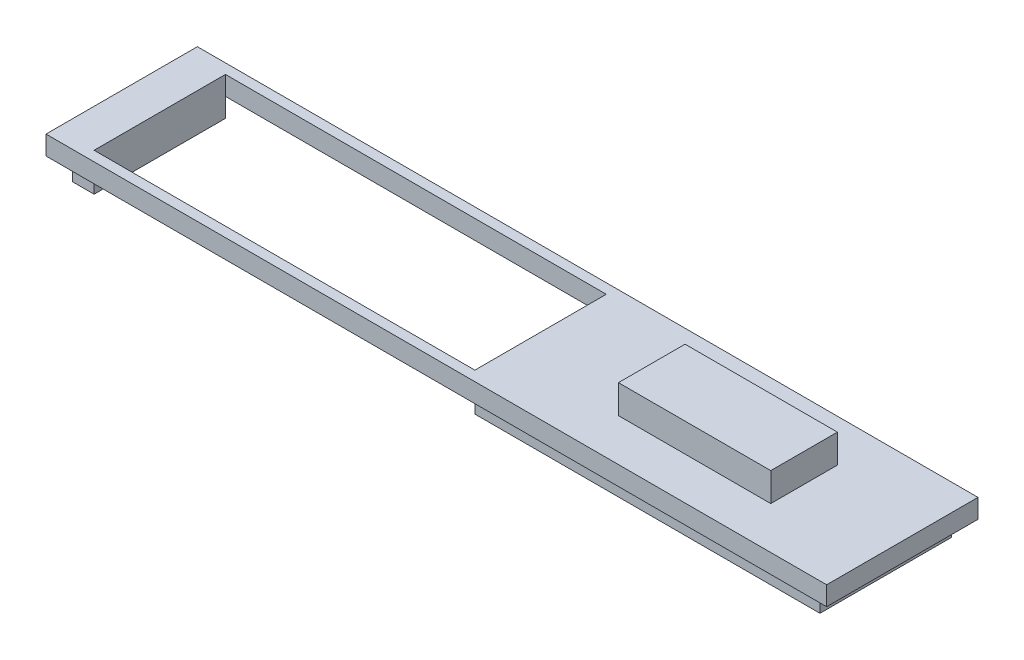
ISO-10303-21;
HEADER;
FILE_DESCRIPTION(('STEP AP214'),'2;1');
FILE_NAME('part.step','',(''),(''),'','','');
FILE_SCHEMA(('AUTOMOTIVE_DESIGN { 1 0 10303 214 1 1 1 1 }'));
ENDSEC;
DATA;
#1=APPLICATION_CONTEXT('core data for automotive mechanical design processes');
#2=APPLICATION_PROTOCOL_DEFINITION('international standard','automotive_design',2000,#1);
#3=PRODUCT_CONTEXT('',#1,'mechanical');
#4=PRODUCT('Part','Part','',(#3));
#5=PRODUCT_RELATED_PRODUCT_CATEGORY('part','',(#4));
#6=PRODUCT_DEFINITION_FORMATION('','',#4);
#7=PRODUCT_DEFINITION_CONTEXT('part definition',#1,'design');
#8=PRODUCT_DEFINITION('design','',#6,#7);
#9=PRODUCT_DEFINITION_SHAPE('','',#8);
#10=(LENGTH_UNIT() NAMED_UNIT(*) SI_UNIT(.MILLI.,.METRE.));
#11=(NAMED_UNIT(*) PLANE_ANGLE_UNIT() SI_UNIT($,.RADIAN.));
#12=(NAMED_UNIT(*) SI_UNIT($,.STERADIAN.) SOLID_ANGLE_UNIT());
#13=UNCERTAINTY_MEASURE_WITH_UNIT(LENGTH_MEASURE(1.E-05),#10,'distance_accuracy_value','');
#14=(GEOMETRIC_REPRESENTATION_CONTEXT(3) GLOBAL_UNCERTAINTY_ASSIGNED_CONTEXT((#13)) GLOBAL_UNIT_ASSIGNED_CONTEXT((#10,
#11,#12)) REPRESENTATION_CONTEXT('',''));
#15=CARTESIAN_POINT('',(0.,0.,0.));
#16=DIRECTION('',(0.,0.,1.));
#17=DIRECTION('',(1.,0.,0.));
#18=AXIS2_PLACEMENT_3D('',#15,#16,#17);
#19=CARTESIAN_POINT('',(49.8475,2.54,8.76299999999999));
#20=DIRECTION('',(0.,0.,-1.));
#21=DIRECTION('',(-1.,0.,0.));
#22=AXIS2_PLACEMENT_3D('',#19,#20,#21);
#23=PLANE('',#22);
#24=DIRECTION('',(1.,0.,0.));
#25=VECTOR('',#24,1.);
#26=CARTESIAN_POINT('',(49.8475,0.,8.76299999999999));
#27=LINE('',#26,#25);
#28=CARTESIAN_POINT('',(-49.8475,0.,8.76300000000001));
#29=VERTEX_POINT('',#28);
#30=CARTESIAN_POINT('',(-46.99,0.,8.76300000000001));
#31=VERTEX_POINT('',#30);
#32=EDGE_CURVE('E176',#29,#31,#27,.T.);
#33=ORIENTED_EDGE('',*,*,#32,.T.);
#34=DIRECTION('',(0.,1.,0.));
#35=VECTOR('',#34,1.);
#36=CARTESIAN_POINT('',(-46.99,0.,8.76300000000001));
#37=LINE('',#36,#35);
#38=CARTESIAN_POINT('',(-46.99,2.54,8.76300000000001));
#39=VERTEX_POINT('',#38);
#40=EDGE_CURVE('E160',#31,#39,#37,.T.);
#41=ORIENTED_EDGE('',*,*,#40,.T.);
#42=DIRECTION('',(1.,0.,0.));
#43=VECTOR('',#42,1.);
#44=CARTESIAN_POINT('',(49.8475,2.54,8.76299999999999));
#45=LINE('',#44,#43);
#46=CARTESIAN_POINT('',(-49.8475,2.54,8.76300000000001));
#47=VERTEX_POINT('',#46);
#48=EDGE_CURVE('E229',#47,#39,#45,.T.);
#49=ORIENTED_EDGE('',*,*,#48,.F.);
#50=DIRECTION('',(0.,-1.,0.));
#51=VECTOR('',#50,1.);
#52=CARTESIAN_POINT('',(-49.8475,2.54,8.76300000000001));
#53=LINE('',#52,#51);
#54=EDGE_CURVE('E11',#47,#29,#53,.T.);
#55=ORIENTED_EDGE('',*,*,#54,.T.);
#56=EDGE_LOOP('',(#33,#41,#49,#55));
#57=FACE_BOUND('',#56,.T.);
#58=ADVANCED_FACE('F36',(#57),#23,.F.);
#59=CARTESIAN_POINT('',(49.8475,2.54,-8.76300000000001));
#60=DIRECTION('',(0.,0.,1.));
#61=DIRECTION('',(1.,0.,0.));
#62=AXIS2_PLACEMENT_3D('',#59,#60,#61);
#63=PLANE('',#62);
#64=DIRECTION('',(-1.,0.,0.));
#65=VECTOR('',#64,1.);
#66=CARTESIAN_POINT('',(49.8475,2.54,-8.76300000000001));
#67=LINE('',#66,#65);
#68=CARTESIAN_POINT('',(-46.99,2.54,-8.76299999999999));
#69=VERTEX_POINT('',#68);
#70=CARTESIAN_POINT('',(-49.8475,2.54,-8.76299999999999));
#71=VERTEX_POINT('',#70);
#72=EDGE_CURVE('E225',#69,#71,#67,.T.);
#73=ORIENTED_EDGE('',*,*,#72,.F.);
#74=DIRECTION('',(0.,1.,0.));
#75=VECTOR('',#74,1.);
#76=CARTESIAN_POINT('',(-46.99,0.,-8.76299999999999));
#77=LINE('',#76,#75);
#78=CARTESIAN_POINT('',(-46.99,0.,-8.76299999999999));
#79=VERTEX_POINT('',#78);
#80=EDGE_CURVE('E288',#79,#69,#77,.T.);
#81=ORIENTED_EDGE('',*,*,#80,.F.);
#82=DIRECTION('',(-1.,0.,0.));
#83=VECTOR('',#82,1.);
#84=CARTESIAN_POINT('',(49.8475,0.,-8.76300000000001));
#85=LINE('',#84,#83);
#86=CARTESIAN_POINT('',(-49.8475,0.,-8.76299999999999));
#87=VERTEX_POINT('',#86);
#88=EDGE_CURVE('E177',#79,#87,#85,.T.);
#89=ORIENTED_EDGE('',*,*,#88,.T.);
#90=DIRECTION('',(0.,-1.,0.));
#91=VECTOR('',#90,1.);
#92=CARTESIAN_POINT('',(-49.8475,2.54,-8.76299999999999));
#93=LINE('',#92,#91);
#94=EDGE_CURVE('E195',#71,#87,#93,.T.);
#95=ORIENTED_EDGE('',*,*,#94,.F.);
#96=EDGE_LOOP('',(#73,#81,#89,#95));
#97=FACE_BOUND('',#96,.T.);
#98=ADVANCED_FACE('F326',(#97),#63,.F.);
#99=CARTESIAN_POINT('',(0.,0.,0.));
#100=DIRECTION('',(0.,1.,0.));
#101=DIRECTION('',(0.,0.,1.));
#102=AXIS2_PLACEMENT_3D('',#99,#100,#101);
#103=PLANE('',#102);
#104=ORIENTED_EDGE('',*,*,#88,.F.);
#105=DIRECTION('',(0.,0.,1.));
#106=VECTOR('',#105,1.);
#107=CARTESIAN_POINT('',(-46.99,0.,8.76300000000001));
#108=LINE('',#107,#106);
#109=EDGE_CURVE('E164',#79,#31,#108,.T.);
#110=ORIENTED_EDGE('',*,*,#109,.T.);
#111=ORIENTED_EDGE('',*,*,#32,.F.);
#112=DIRECTION('',(0.,0.,1.));
#113=VECTOR('',#112,1.);
#114=CARTESIAN_POINT('',(-49.8475,0.,8.76300000000001));
#115=LINE('',#114,#113);
#116=EDGE_CURVE('E187',#87,#29,#115,.T.);
#117=ORIENTED_EDGE('',*,*,#116,.F.);
#118=EDGE_LOOP('',(#104,#110,#111,#117));
#119=FACE_BOUND('',#118,.T.);
#120=ADVANCED_FACE('F174',(#119),#103,.F.);
#121=CARTESIAN_POINT('',(0.,5.08,0.));
#122=DIRECTION('',(0.,1.,0.));
#123=DIRECTION('',(0.,0.,1.));
#124=AXIS2_PLACEMENT_3D('',#121,#122,#123);
#125=PLANE('',#124);
#126=DIRECTION('',(0.,0.,1.));
#127=VECTOR('',#126,1.);
#128=CARTESIAN_POINT('',(-46.99,5.08,8.76300000000001));
#129=LINE('',#128,#127);
#130=CARTESIAN_POINT('',(-46.99,5.08,-8.76299999999999));
#131=VERTEX_POINT('',#130);
#132=CARTESIAN_POINT('',(-46.99,5.08,8.76300000000001));
#133=VERTEX_POINT('',#132);
#134=EDGE_CURVE('E51',#131,#133,#129,.T.);
#135=ORIENTED_EDGE('',*,*,#134,.F.);
#136=DIRECTION('',(-1.,0.,0.));
#137=VECTOR('',#136,1.);
#138=CARTESIAN_POINT('',(3.80999999999999,5.08,-8.76299999999999));
#139=LINE('',#138,#137);
#140=CARTESIAN_POINT('',(3.80999999999999,5.08,-8.76299999999999));
#141=VERTEX_POINT('',#140);
#142=EDGE_CURVE('E179',#141,#131,#139,.T.);
#143=ORIENTED_EDGE('',*,*,#142,.F.);
#144=DIRECTION('',(0.,0.,-1.));
#145=VECTOR('',#144,1.);
#146=CARTESIAN_POINT('',(3.80999999999999,5.08,8.76300000000001));
#147=LINE('',#146,#145);
#148=CARTESIAN_POINT('',(3.80999999999999,5.08,8.76300000000001));
#149=VERTEX_POINT('',#148);
#150=EDGE_CURVE('E303',#149,#141,#147,.T.);
#151=ORIENTED_EDGE('',*,*,#150,.F.);
#152=DIRECTION('',(1.,0.,0.));
#153=VECTOR('',#152,1.);
#154=CARTESIAN_POINT('',(3.80999999999999,5.08,8.76300000000001));
#155=LINE('',#154,#153);
#156=EDGE_CURVE('E306',#133,#149,#155,.T.);
#157=ORIENTED_EDGE('',*,*,#156,.F.);
#158=EDGE_LOOP('',(#135,#143,#151,#157));
#159=FACE_BOUND('',#158,.T.);
#160=DIRECTION('',(0.,0.,1.));
#161=VECTOR('',#160,1.);
#162=CARTESIAN_POINT('',(-52.07,5.08,10.0965));
#163=LINE('',#162,#161);
#164=CARTESIAN_POINT('',(-52.07,5.08,-10.0965));
#165=VERTEX_POINT('',#164);
#166=CARTESIAN_POINT('',(-52.07,5.08,10.0965));
#167=VERTEX_POINT('',#166);
#168=EDGE_CURVE('E251',#165,#167,#163,.T.);
#169=ORIENTED_EDGE('',*,*,#168,.T.);
#170=DIRECTION('',(1.,0.,0.));
#171=VECTOR('',#170,1.);
#172=CARTESIAN_POINT('',(52.07,5.08,10.0965));
#173=LINE('',#172,#171);
#174=CARTESIAN_POINT('',(52.07,5.08,10.0965));
#175=VERTEX_POINT('',#174);
#176=EDGE_CURVE('E263',#167,#175,#173,.T.);
#177=ORIENTED_EDGE('',*,*,#176,.T.);
#178=DIRECTION('',(0.,0.,-1.));
#179=VECTOR('',#178,1.);
#180=CARTESIAN_POINT('',(52.07,5.08,10.0965));
#181=LINE('',#180,#179);
#182=CARTESIAN_POINT('',(52.07,5.08,-10.0965));
#183=VERTEX_POINT('',#182);
#184=EDGE_CURVE('E261',#175,#183,#181,.T.);
#185=ORIENTED_EDGE('',*,*,#184,.T.);
#186=DIRECTION('',(-1.,0.,0.));
#187=VECTOR('',#186,1.);
#188=CARTESIAN_POINT('',(52.07,5.08,-10.0965));
#189=LINE('',#188,#187);
#190=EDGE_CURVE('E248',#183,#165,#189,.T.);
#191=ORIENTED_EDGE('',*,*,#190,.T.);
#192=EDGE_LOOP('',(#169,#177,#185,#191));
#193=FACE_BOUND('',#192,.T.);
#194=DIRECTION('',(-1.,0.,0.));
#195=VECTOR('',#194,1.);
#196=CARTESIAN_POINT('',(18.6435855304256,5.08,-4.445));
#197=LINE('',#196,#195);
#198=CARTESIAN_POINT('',(38.9635855304256,5.08,-4.445));
#199=VERTEX_POINT('',#198);
#200=CARTESIAN_POINT('',(18.6435855304256,5.08,-4.445));
#201=VERTEX_POINT('',#200);
#202=EDGE_CURVE('E283',#199,#201,#197,.T.);
#203=ORIENTED_EDGE('',*,*,#202,.F.);
#204=DIRECTION('',(0.,0.,-1.));
#205=VECTOR('',#204,1.);
#206=CARTESIAN_POINT('',(38.9635855304256,5.08,4.445));
#207=LINE('',#206,#205);
#208=CARTESIAN_POINT('',(38.9635855304256,5.08,4.445));
#209=VERTEX_POINT('',#208);
#210=EDGE_CURVE('E285',#209,#199,#207,.T.);
#211=ORIENTED_EDGE('',*,*,#210,.F.);
#212=DIRECTION('',(1.,0.,0.));
#213=VECTOR('',#212,1.);
#214=CARTESIAN_POINT('',(18.6435855304256,5.08,4.445));
#215=LINE('',#214,#213);
#216=CARTESIAN_POINT('',(18.6435855304256,5.08,4.445));
#217=VERTEX_POINT('',#216);
#218=EDGE_CURVE('E277',#217,#209,#215,.T.);
#219=ORIENTED_EDGE('',*,*,#218,.F.);
#220=DIRECTION('',(0.,0.,1.));
#221=VECTOR('',#220,1.);
#222=CARTESIAN_POINT('',(18.6435855304256,5.08,4.445));
#223=LINE('',#222,#221);
#224=EDGE_CURVE('E280',#201,#217,#223,.T.);
#225=ORIENTED_EDGE('',*,*,#224,.F.);
#226=EDGE_LOOP('',(#203,#211,#219,#225));
#227=FACE_BOUND('',#226,.T.);
#228=ADVANCED_FACE('F315',(#159,#193,#227),#125,.T.);
#229=CARTESIAN_POINT('',(-49.8475,2.54,8.76300000000001));
#230=DIRECTION('',(1.,0.,0.));
#231=DIRECTION('',(0.,0.,-1.));
#232=AXIS2_PLACEMENT_3D('',#229,#230,#231);
#233=PLANE('',#232);
#234=ORIENTED_EDGE('',*,*,#116,.T.);
#235=ORIENTED_EDGE('',*,*,#54,.F.);
#236=DIRECTION('',(0.,0.,1.));
#237=VECTOR('',#236,1.);
#238=CARTESIAN_POINT('',(-49.8475,2.54,8.76300000000001));
#239=LINE('',#238,#237);
#240=EDGE_CURVE('E194',#71,#47,#239,.T.);
#241=ORIENTED_EDGE('',*,*,#240,.F.);
#242=ORIENTED_EDGE('',*,*,#94,.T.);
#243=EDGE_LOOP('',(#234,#235,#241,#242));
#244=FACE_BOUND('',#243,.T.);
#245=ADVANCED_FACE('F38',(#244),#233,.F.);
#246=CARTESIAN_POINT('',(3.80999999999999,2.54,8.763));
#247=VERTEX_POINT('',#246);
#248=CARTESIAN_POINT('',(49.8475,2.54,8.76299999999999));
#249=VERTEX_POINT('',#248);
#250=EDGE_CURVE('E228',#247,#249,#45,.T.);
#251=ORIENTED_EDGE('',*,*,#250,.F.);
#252=DIRECTION('',(0.,1.,0.));
#253=VECTOR('',#252,1.);
#254=CARTESIAN_POINT('',(3.80999999999999,0.,8.76300000000001));
#255=LINE('',#254,#253);
#256=CARTESIAN_POINT('',(3.80999999999999,0.,8.76300000000001));
#257=VERTEX_POINT('',#256);
#258=EDGE_CURVE('E59',#257,#247,#255,.T.);
#259=ORIENTED_EDGE('',*,*,#258,.F.);
#260=CARTESIAN_POINT('',(49.8475,0.,8.76299999999999));
#261=VERTEX_POINT('',#260);
#262=EDGE_CURVE('E184',#257,#261,#27,.T.);
#263=ORIENTED_EDGE('',*,*,#262,.T.);
#264=DIRECTION('',(0.,-1.,0.));
#265=VECTOR('',#264,1.);
#266=CARTESIAN_POINT('',(49.8475,2.54,8.76299999999999));
#267=LINE('',#266,#265);
#268=EDGE_CURVE('E44',#249,#261,#267,.T.);
#269=ORIENTED_EDGE('',*,*,#268,.F.);
#270=EDGE_LOOP('',(#251,#259,#263,#269));
#271=FACE_BOUND('',#270,.T.);
#272=ADVANCED_FACE('F320',(#271),#23,.F.);
#273=CARTESIAN_POINT('',(49.8475,2.54,8.76299999999999));
#274=DIRECTION('',(-1.,0.,0.));
#275=DIRECTION('',(0.,0.,1.));
#276=AXIS2_PLACEMENT_3D('',#273,#274,#275);
#277=PLANE('',#276);
#278=DIRECTION('',(0.,0.,-1.));
#279=VECTOR('',#278,1.);
#280=CARTESIAN_POINT('',(49.8475,0.,8.76299999999999));
#281=LINE('',#280,#279);
#282=CARTESIAN_POINT('',(49.8475,0.,-8.76300000000001));
#283=VERTEX_POINT('',#282);
#284=EDGE_CURVE('E183',#261,#283,#281,.T.);
#285=ORIENTED_EDGE('',*,*,#284,.T.);
#286=DIRECTION('',(0.,-1.,0.));
#287=VECTOR('',#286,1.);
#288=CARTESIAN_POINT('',(49.8475,2.54,-8.76300000000001));
#289=LINE('',#288,#287);
#290=CARTESIAN_POINT('',(49.8475,2.54,-8.76300000000001));
#291=VERTEX_POINT('',#290);
#292=EDGE_CURVE('E198',#291,#283,#289,.T.);
#293=ORIENTED_EDGE('',*,*,#292,.F.);
#294=DIRECTION('',(0.,0.,-1.));
#295=VECTOR('',#294,1.);
#296=CARTESIAN_POINT('',(49.8475,2.54,8.76299999999999));
#297=LINE('',#296,#295);
#298=EDGE_CURVE('E208',#249,#291,#297,.T.);
#299=ORIENTED_EDGE('',*,*,#298,.F.);
#300=ORIENTED_EDGE('',*,*,#268,.T.);
#301=EDGE_LOOP('',(#285,#293,#299,#300));
#302=FACE_BOUND('',#301,.T.);
#303=ADVANCED_FACE('F206',(#302),#277,.F.);
#304=CARTESIAN_POINT('',(3.80999999999999,0.,-8.76299999999999));
#305=VERTEX_POINT('',#304);
#306=EDGE_CURVE('E191',#283,#305,#85,.T.);
#307=ORIENTED_EDGE('',*,*,#306,.T.);
#308=DIRECTION('',(0.,1.,0.));
#309=VECTOR('',#308,1.);
#310=CARTESIAN_POINT('',(3.80999999999999,0.,-8.76299999999999));
#311=LINE('',#310,#309);
#312=CARTESIAN_POINT('',(3.80999999999999,2.54,-8.76299999999999));
#313=VERTEX_POINT('',#312);
#314=EDGE_CURVE('E220',#305,#313,#311,.T.);
#315=ORIENTED_EDGE('',*,*,#314,.T.);
#316=EDGE_CURVE('E199',#291,#313,#67,.T.);
#317=ORIENTED_EDGE('',*,*,#316,.F.);
#318=ORIENTED_EDGE('',*,*,#292,.T.);
#319=EDGE_LOOP('',(#307,#315,#317,#318));
#320=FACE_BOUND('',#319,.T.);
#321=ADVANCED_FACE('F218',(#320),#63,.F.);
#322=ORIENTED_EDGE('',*,*,#262,.F.);
#323=DIRECTION('',(0.,0.,-1.));
#324=VECTOR('',#323,1.);
#325=CARTESIAN_POINT('',(3.80999999999999,0.,8.76300000000001));
#326=LINE('',#325,#324);
#327=EDGE_CURVE('E178',#257,#305,#326,.T.);
#328=ORIENTED_EDGE('',*,*,#327,.T.);
#329=ORIENTED_EDGE('',*,*,#306,.F.);
#330=ORIENTED_EDGE('',*,*,#284,.F.);
#331=EDGE_LOOP('',(#322,#328,#329,#330));
#332=FACE_BOUND('',#331,.T.);
#333=ADVANCED_FACE('F214',(#332),#103,.F.);
#334=CARTESIAN_POINT('',(0.,2.54,0.));
#335=DIRECTION('',(0.,1.,0.));
#336=DIRECTION('',(0.,0.,1.));
#337=AXIS2_PLACEMENT_3D('',#334,#335,#336);
#338=PLANE('',#337);
#339=DIRECTION('',(0.,0.,1.));
#340=VECTOR('',#339,1.);
#341=CARTESIAN_POINT('',(-52.07,2.54,10.0965));
#342=LINE('',#341,#340);
#343=CARTESIAN_POINT('',(-52.07,2.54,-10.0965));
#344=VERTEX_POINT('',#343);
#345=CARTESIAN_POINT('',(-52.07,2.54,10.0965));
#346=VERTEX_POINT('',#345);
#347=EDGE_CURVE('E256',#344,#346,#342,.T.);
#348=ORIENTED_EDGE('',*,*,#347,.F.);
#349=DIRECTION('',(-1.,0.,0.));
#350=VECTOR('',#349,1.);
#351=CARTESIAN_POINT('',(52.07,2.54,-10.0965));
#352=LINE('',#351,#350);
#353=CARTESIAN_POINT('',(52.07,2.54,-10.0965));
#354=VERTEX_POINT('',#353);
#355=EDGE_CURVE('E249',#354,#344,#352,.T.);
#356=ORIENTED_EDGE('',*,*,#355,.F.);
#357=DIRECTION('',(0.,0.,-1.));
#358=VECTOR('',#357,1.);
#359=CARTESIAN_POINT('',(52.07,2.54,10.0965));
#360=LINE('',#359,#358);
#361=CARTESIAN_POINT('',(52.07,2.54,10.0965));
#362=VERTEX_POINT('',#361);
#363=EDGE_CURVE('E252',#362,#354,#360,.T.);
#364=ORIENTED_EDGE('',*,*,#363,.F.);
#365=DIRECTION('',(1.,0.,0.));
#366=VECTOR('',#365,1.);
#367=CARTESIAN_POINT('',(52.07,2.54,10.0965));
#368=LINE('',#367,#366);
#369=EDGE_CURVE('E254',#346,#362,#368,.T.);
#370=ORIENTED_EDGE('',*,*,#369,.F.);
#371=EDGE_LOOP('',(#348,#356,#364,#370));
#372=FACE_BOUND('',#371,.T.);
#373=ORIENTED_EDGE('',*,*,#316,.T.);
#374=EDGE_CURVE('E224',#313,#69,#67,.T.);
#375=ORIENTED_EDGE('',*,*,#374,.T.);
#376=ORIENTED_EDGE('',*,*,#72,.T.);
#377=ORIENTED_EDGE('',*,*,#240,.T.);
#378=ORIENTED_EDGE('',*,*,#48,.T.);
#379=EDGE_CURVE('E231',#39,#247,#45,.T.);
#380=ORIENTED_EDGE('',*,*,#379,.T.);
#381=ORIENTED_EDGE('',*,*,#250,.T.);
#382=ORIENTED_EDGE('',*,*,#298,.T.);
#383=EDGE_LOOP('',(#373,#375,#376,#377,#378,#380,#381,#382));
#384=FACE_BOUND('',#383,.T.);
#385=ADVANCED_FACE('F226',(#372,#384),#338,.F.);
#386=CARTESIAN_POINT('',(-52.07,5.08,10.0965));
#387=DIRECTION('',(1.,0.,0.));
#388=DIRECTION('',(0.,0.,-1.));
#389=AXIS2_PLACEMENT_3D('',#386,#387,#388);
#390=PLANE('',#389);
#391=ORIENTED_EDGE('',*,*,#347,.T.);
#392=DIRECTION('',(0.,-1.,0.));
#393=VECTOR('',#392,1.);
#394=CARTESIAN_POINT('',(-52.07,5.08,10.0965));
#395=LINE('',#394,#393);
#396=EDGE_CURVE('E236',#167,#346,#395,.T.);
#397=ORIENTED_EDGE('',*,*,#396,.F.);
#398=ORIENTED_EDGE('',*,*,#168,.F.);
#399=DIRECTION('',(0.,-1.,0.));
#400=VECTOR('',#399,1.);
#401=CARTESIAN_POINT('',(-52.07,5.08,-10.0965));
#402=LINE('',#401,#400);
#403=EDGE_CURVE('E245',#165,#344,#402,.T.);
#404=ORIENTED_EDGE('',*,*,#403,.T.);
#405=EDGE_LOOP('',(#391,#397,#398,#404));
#406=FACE_BOUND('',#405,.T.);
#407=ADVANCED_FACE('F366',(#406),#390,.F.);
#408=CARTESIAN_POINT('',(52.07,5.08,10.0965));
#409=DIRECTION('',(0.,0.,-1.));
#410=DIRECTION('',(-1.,0.,0.));
#411=AXIS2_PLACEMENT_3D('',#408,#409,#410);
#412=PLANE('',#411);
#413=ORIENTED_EDGE('',*,*,#369,.T.);
#414=DIRECTION('',(0.,-1.,0.));
#415=VECTOR('',#414,1.);
#416=CARTESIAN_POINT('',(52.07,5.08,10.0965));
#417=LINE('',#416,#415);
#418=EDGE_CURVE('E239',#175,#362,#417,.T.);
#419=ORIENTED_EDGE('',*,*,#418,.F.);
#420=ORIENTED_EDGE('',*,*,#176,.F.);
#421=ORIENTED_EDGE('',*,*,#396,.T.);
#422=EDGE_LOOP('',(#413,#419,#420,#421));
#423=FACE_BOUND('',#422,.T.);
#424=ADVANCED_FACE('F375',(#423),#412,.F.);
#425=CARTESIAN_POINT('',(52.07,5.08,10.0965));
#426=DIRECTION('',(-1.,0.,0.));
#427=DIRECTION('',(0.,0.,1.));
#428=AXIS2_PLACEMENT_3D('',#425,#426,#427);
#429=PLANE('',#428);
#430=ORIENTED_EDGE('',*,*,#363,.T.);
#431=DIRECTION('',(0.,-1.,0.));
#432=VECTOR('',#431,1.);
#433=CARTESIAN_POINT('',(52.07,5.08,-10.0965));
#434=LINE('',#433,#432);
#435=EDGE_CURVE('E242',#183,#354,#434,.T.);
#436=ORIENTED_EDGE('',*,*,#435,.F.);
#437=ORIENTED_EDGE('',*,*,#184,.F.);
#438=ORIENTED_EDGE('',*,*,#418,.T.);
#439=EDGE_LOOP('',(#430,#436,#437,#438));
#440=FACE_BOUND('',#439,.T.);
#441=ADVANCED_FACE('F371',(#440),#429,.F.);
#442=CARTESIAN_POINT('',(52.07,5.08,-10.0965));
#443=DIRECTION('',(0.,0.,1.));
#444=DIRECTION('',(1.,0.,0.));
#445=AXIS2_PLACEMENT_3D('',#442,#443,#444);
#446=PLANE('',#445);
#447=ORIENTED_EDGE('',*,*,#355,.T.);
#448=ORIENTED_EDGE('',*,*,#403,.F.);
#449=ORIENTED_EDGE('',*,*,#190,.F.);
#450=ORIENTED_EDGE('',*,*,#435,.T.);
#451=EDGE_LOOP('',(#447,#448,#449,#450));
#452=FACE_BOUND('',#451,.T.);
#453=ADVANCED_FACE('F368',(#452),#446,.F.);
#454=CARTESIAN_POINT('',(38.9635855304256,8.89,4.445));
#455=DIRECTION('',(-1.,0.,0.));
#456=DIRECTION('',(0.,0.,1.));
#457=AXIS2_PLACEMENT_3D('',#454,#455,#456);
#458=PLANE('',#457);
#459=ORIENTED_EDGE('',*,*,#210,.T.);
#460=DIRECTION('',(0.,-1.,0.));
#461=VECTOR('',#460,1.);
#462=CARTESIAN_POINT('',(38.9635855304256,8.89,-4.445));
#463=LINE('',#462,#461);
#464=CARTESIAN_POINT('',(38.9635855304256,8.89,-4.445));
#465=VERTEX_POINT('',#464);
#466=EDGE_CURVE('E259',#465,#199,#463,.T.);
#467=ORIENTED_EDGE('',*,*,#466,.F.);
#468=DIRECTION('',(0.,0.,-1.));
#469=VECTOR('',#468,1.);
#470=CARTESIAN_POINT('',(38.9635855304256,8.89,4.445));
#471=LINE('',#470,#469);
#472=CARTESIAN_POINT('',(38.9635855304256,8.89,4.445));
#473=VERTEX_POINT('',#472);
#474=EDGE_CURVE('E279',#473,#465,#471,.T.);
#475=ORIENTED_EDGE('',*,*,#474,.F.);
#476=DIRECTION('',(0.,-1.,0.));
#477=VECTOR('',#476,1.);
#478=CARTESIAN_POINT('',(38.9635855304256,8.89,4.445));
#479=LINE('',#478,#477);
#480=EDGE_CURVE('E273',#473,#209,#479,.T.);
#481=ORIENTED_EDGE('',*,*,#480,.T.);
#482=EDGE_LOOP('',(#459,#467,#475,#481));
#483=FACE_BOUND('',#482,.T.);
#484=ADVANCED_FACE('F362',(#483),#458,.F.);
#485=CARTESIAN_POINT('',(18.6435855304256,8.89,-4.445));
#486=DIRECTION('',(0.,0.,1.));
#487=DIRECTION('',(1.,0.,0.));
#488=AXIS2_PLACEMENT_3D('',#485,#486,#487);
#489=PLANE('',#488);
#490=ORIENTED_EDGE('',*,*,#202,.T.);
#491=DIRECTION('',(0.,-1.,0.));
#492=VECTOR('',#491,1.);
#493=CARTESIAN_POINT('',(18.6435855304256,8.89,-4.445));
#494=LINE('',#493,#492);
#495=CARTESIAN_POINT('',(18.6435855304256,8.89,-4.445));
#496=VERTEX_POINT('',#495);
#497=EDGE_CURVE('E268',#496,#201,#494,.T.);
#498=ORIENTED_EDGE('',*,*,#497,.F.);
#499=DIRECTION('',(-1.,0.,0.));
#500=VECTOR('',#499,1.);
#501=CARTESIAN_POINT('',(18.6435855304256,8.89,-4.445));
#502=LINE('',#501,#500);
#503=EDGE_CURVE('E292',#465,#496,#502,.T.);
#504=ORIENTED_EDGE('',*,*,#503,.F.);
#505=ORIENTED_EDGE('',*,*,#466,.T.);
#506=EDGE_LOOP('',(#490,#498,#504,#505));
#507=FACE_BOUND('',#506,.T.);
#508=ADVANCED_FACE('F418',(#507),#489,.F.);
#509=CARTESIAN_POINT('',(18.6435855304256,8.89,4.445));
#510=DIRECTION('',(1.,0.,0.));
#511=DIRECTION('',(0.,0.,-1.));
#512=AXIS2_PLACEMENT_3D('',#509,#510,#511);
#513=PLANE('',#512);
#514=ORIENTED_EDGE('',*,*,#224,.T.);
#515=DIRECTION('',(0.,-1.,0.));
#516=VECTOR('',#515,1.);
#517=CARTESIAN_POINT('',(18.6435855304256,8.89,4.445));
#518=LINE('',#517,#516);
#519=CARTESIAN_POINT('',(18.6435855304256,8.89,4.445));
#520=VERTEX_POINT('',#519);
#521=EDGE_CURVE('E271',#520,#217,#518,.T.);
#522=ORIENTED_EDGE('',*,*,#521,.F.);
#523=DIRECTION('',(0.,0.,1.));
#524=VECTOR('',#523,1.);
#525=CARTESIAN_POINT('',(18.6435855304256,8.89,4.445));
#526=LINE('',#525,#524);
#527=EDGE_CURVE('E290',#496,#520,#526,.T.);
#528=ORIENTED_EDGE('',*,*,#527,.F.);
#529=ORIENTED_EDGE('',*,*,#497,.T.);
#530=EDGE_LOOP('',(#514,#522,#528,#529));
#531=FACE_BOUND('',#530,.T.);
#532=ADVANCED_FACE('F425',(#531),#513,.F.);
#533=CARTESIAN_POINT('',(18.6435855304256,8.89,4.445));
#534=DIRECTION('',(0.,0.,-1.));
#535=DIRECTION('',(-1.,0.,0.));
#536=AXIS2_PLACEMENT_3D('',#533,#534,#535);
#537=PLANE('',#536);
#538=ORIENTED_EDGE('',*,*,#218,.T.);
#539=ORIENTED_EDGE('',*,*,#480,.F.);
#540=DIRECTION('',(1.,0.,0.));
#541=VECTOR('',#540,1.);
#542=CARTESIAN_POINT('',(18.6435855304256,8.89,4.445));
#543=LINE('',#542,#541);
#544=EDGE_CURVE('E276',#520,#473,#543,.T.);
#545=ORIENTED_EDGE('',*,*,#544,.F.);
#546=ORIENTED_EDGE('',*,*,#521,.T.);
#547=EDGE_LOOP('',(#538,#539,#545,#546));
#548=FACE_BOUND('',#547,.T.);
#549=ADVANCED_FACE('F337',(#548),#537,.F.);
#550=CARTESIAN_POINT('',(0.,8.89,0.));
#551=DIRECTION('',(0.,-1.,0.));
#552=DIRECTION('',(0.,0.,-1.));
#553=AXIS2_PLACEMENT_3D('',#550,#551,#552);
#554=PLANE('',#553);
#555=ORIENTED_EDGE('',*,*,#474,.T.);
#556=ORIENTED_EDGE('',*,*,#503,.T.);
#557=ORIENTED_EDGE('',*,*,#527,.T.);
#558=ORIENTED_EDGE('',*,*,#544,.T.);
#559=EDGE_LOOP('',(#555,#556,#557,#558));
#560=FACE_BOUND('',#559,.T.);
#561=ADVANCED_FACE('F330',(#560),#554,.F.);
#562=CARTESIAN_POINT('',(3.80999999999999,0.,-8.76299999999999));
#563=DIRECTION('',(0.,0.,-1.));
#564=DIRECTION('',(-1.,0.,0.));
#565=AXIS2_PLACEMENT_3D('',#562,#563,#564);
#566=PLANE('',#565);
#567=EDGE_CURVE('E297',#313,#141,#311,.T.);
#568=ORIENTED_EDGE('',*,*,#567,.T.);
#569=ORIENTED_EDGE('',*,*,#142,.T.);
#570=EDGE_CURVE('E299',#69,#131,#77,.T.);
#571=ORIENTED_EDGE('',*,*,#570,.F.);
#572=ORIENTED_EDGE('',*,*,#374,.F.);
#573=EDGE_LOOP('',(#568,#569,#571,#572));
#574=FACE_BOUND('',#573,.T.);
#575=ADVANCED_FACE('F328',(#574),#566,.F.);
#576=CARTESIAN_POINT('',(3.80999999999999,0.,8.76300000000001));
#577=DIRECTION('',(0.,0.,1.));
#578=DIRECTION('',(1.,0.,0.));
#579=AXIS2_PLACEMENT_3D('',#576,#577,#578);
#580=PLANE('',#579);
#581=EDGE_CURVE('E166',#39,#133,#37,.T.);
#582=ORIENTED_EDGE('',*,*,#581,.T.);
#583=ORIENTED_EDGE('',*,*,#156,.T.);
#584=EDGE_CURVE('E170',#247,#149,#255,.T.);
#585=ORIENTED_EDGE('',*,*,#584,.F.);
#586=ORIENTED_EDGE('',*,*,#379,.F.);
#587=EDGE_LOOP('',(#582,#583,#585,#586));
#588=FACE_BOUND('',#587,.T.);
#589=ADVANCED_FACE('F312',(#588),#580,.F.);
#590=CARTESIAN_POINT('',(-46.99,0.,8.76300000000001));
#591=DIRECTION('',(-1.,0.,0.));
#592=DIRECTION('',(0.,0.,1.));
#593=AXIS2_PLACEMENT_3D('',#590,#591,#592);
#594=PLANE('',#593);
#595=ORIENTED_EDGE('',*,*,#134,.T.);
#596=ORIENTED_EDGE('',*,*,#581,.F.);
#597=ORIENTED_EDGE('',*,*,#40,.F.);
#598=ORIENTED_EDGE('',*,*,#109,.F.);
#599=ORIENTED_EDGE('',*,*,#80,.T.);
#600=ORIENTED_EDGE('',*,*,#570,.T.);
#601=EDGE_LOOP('',(#595,#596,#597,#598,#599,#600));
#602=FACE_BOUND('',#601,.T.);
#603=ADVANCED_FACE('F162',(#602),#594,.F.);
#604=CARTESIAN_POINT('',(3.80999999999999,0.,8.76300000000001));
#605=DIRECTION('',(1.,0.,0.));
#606=DIRECTION('',(0.,0.,-1.));
#607=AXIS2_PLACEMENT_3D('',#604,#605,#606);
#608=PLANE('',#607);
#609=ORIENTED_EDGE('',*,*,#150,.T.);
#610=ORIENTED_EDGE('',*,*,#567,.F.);
#611=ORIENTED_EDGE('',*,*,#314,.F.);
#612=ORIENTED_EDGE('',*,*,#327,.F.);
#613=ORIENTED_EDGE('',*,*,#258,.T.);
#614=ORIENTED_EDGE('',*,*,#584,.T.);
#615=EDGE_LOOP('',(#609,#610,#611,#612,#613,#614));
#616=FACE_BOUND('',#615,.T.);
#617=ADVANCED_FACE('F319',(#616),#608,.F.);
#618=CLOSED_SHELL('',(#58,#98,#120,#228,#245,#272,#303,#321,#333,#385,#407,#424,#441,#453,#484,
#508,#532,#549,#561,#575,#589,#603,#617));
#619=MANIFOLD_SOLID_BREP('B2',#618);
#620=ADVANCED_BREP_SHAPE_REPRESENTATION('',(#18,#619),#14);
#621=SHAPE_DEFINITION_REPRESENTATION(#9,#620);
ENDSEC;
END-ISO-10303-21;
